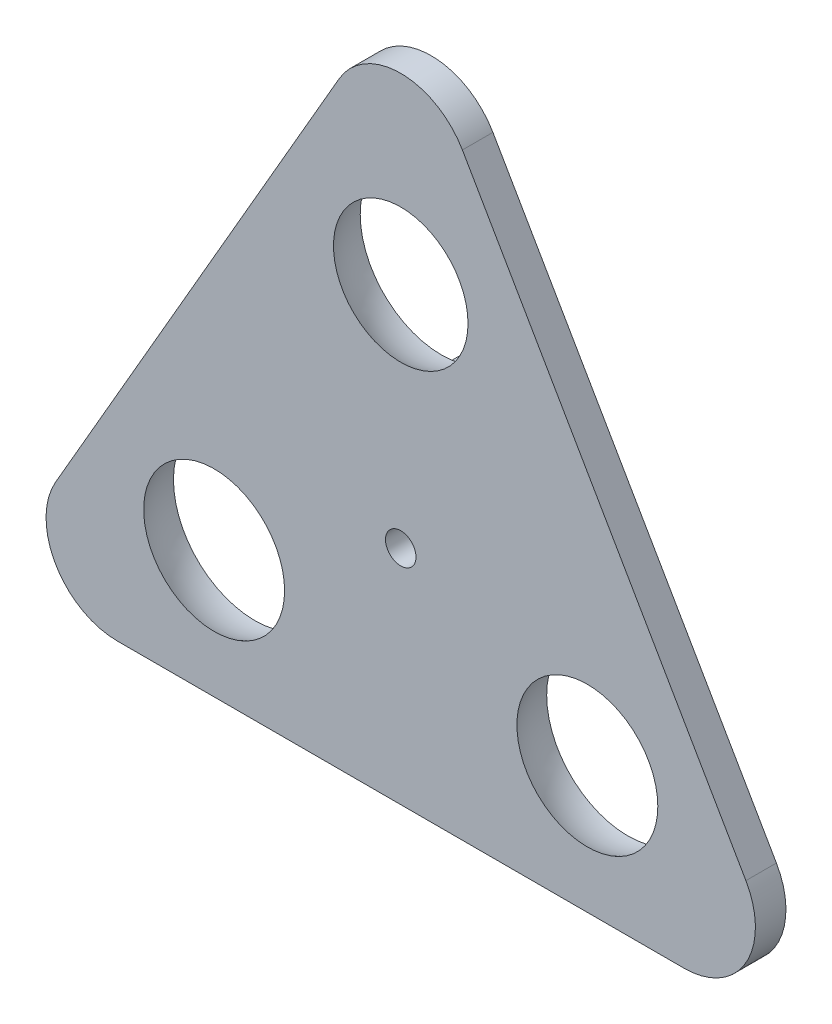
ISO-10303-21;
HEADER;
FILE_DESCRIPTION(('STEP AP214'),'2;1');
FILE_NAME('part.step','',(''),(''),'','','');
FILE_SCHEMA(('AUTOMOTIVE_DESIGN { 1 0 10303 214 1 1 1 1 }'));
ENDSEC;
DATA;
#1=APPLICATION_CONTEXT('core data for automotive mechanical design processes');
#2=APPLICATION_PROTOCOL_DEFINITION('international standard','automotive_design',2000,#1);
#3=PRODUCT_CONTEXT('',#1,'mechanical');
#4=PRODUCT('Part','Part','',(#3));
#5=PRODUCT_RELATED_PRODUCT_CATEGORY('part','',(#4));
#6=PRODUCT_DEFINITION_FORMATION('','',#4);
#7=PRODUCT_DEFINITION_CONTEXT('part definition',#1,'design');
#8=PRODUCT_DEFINITION('design','',#6,#7);
#9=PRODUCT_DEFINITION_SHAPE('','',#8);
#10=(LENGTH_UNIT() NAMED_UNIT(*) SI_UNIT(.MILLI.,.METRE.));
#11=(NAMED_UNIT(*) PLANE_ANGLE_UNIT() SI_UNIT($,.RADIAN.));
#12=(NAMED_UNIT(*) SI_UNIT($,.STERADIAN.) SOLID_ANGLE_UNIT());
#13=UNCERTAINTY_MEASURE_WITH_UNIT(LENGTH_MEASURE(1.E-05),#10,'distance_accuracy_value','');
#14=(GEOMETRIC_REPRESENTATION_CONTEXT(3) GLOBAL_UNCERTAINTY_ASSIGNED_CONTEXT((#13)) GLOBAL_UNIT_ASSIGNED_CONTEXT((#10,
#11,#12)) REPRESENTATION_CONTEXT('',''));
#15=CARTESIAN_POINT('',(0.,0.,0.));
#16=DIRECTION('',(0.,0.,1.));
#17=DIRECTION('',(1.,0.,0.));
#18=AXIS2_PLACEMENT_3D('',#15,#16,#17);
#19=CARTESIAN_POINT('',(0.,0.,0.));
#20=DIRECTION('',(0.,0.,1.));
#21=DIRECTION('',(1.,0.,0.));
#22=AXIS2_PLACEMENT_3D('',#19,#20,#21);
#23=PLANE('',#22);
#24=CARTESIAN_POINT('',(40.,21.8287902820327,0.));
#25=DIRECTION('',(0.,0.,1.));
#26=DIRECTION('',(1.,0.,0.));
#27=AXIS2_PLACEMENT_3D('',#24,#25,#26);
#28=CIRCLE('',#27,1.5);
#29=CARTESIAN_POINT('',(41.5,21.8287902820327,0.));
#30=VERTEX_POINT('',#29);
#31=EDGE_CURVE('E614',#30,#30,#28,.T.);
#32=ORIENTED_EDGE('',*,*,#31,.T.);
#33=EDGE_LOOP('',(#32));
#34=FACE_BOUND('',#33,.T.);
#35=DIRECTION('',(-1.,0.,0.));
#36=VECTOR('',#35,1.);
#37=CARTESIAN_POINT('',(37.,14.3287902820327,0.));
#38=LINE('',#37,#36);
#39=CARTESIAN_POINT('',(37.,14.3287902820327,0.));
#40=VERTEX_POINT('',#39);
#41=CARTESIAN_POINT('',(34.,14.3287902820327,0.));
#42=VERTEX_POINT('',#41);
#43=EDGE_CURVE('E157',#40,#42,#38,.T.);
#44=ORIENTED_EDGE('',*,*,#43,.F.);
#45=DIRECTION('',(0.,-1.,0.));
#46=VECTOR('',#45,1.);
#47=CARTESIAN_POINT('',(37.,29.3287902820327,0.));
#48=LINE('',#47,#46);
#49=CARTESIAN_POINT('',(37.,29.3287902820327,0.));
#50=VERTEX_POINT('',#49);
#51=EDGE_CURVE('E170',#50,#40,#48,.T.);
#52=ORIENTED_EDGE('',*,*,#51,.F.);
#53=DIRECTION('',(1.,0.,0.));
#54=VECTOR('',#53,1.);
#55=CARTESIAN_POINT('',(37.,29.3287902820327,0.));
#56=LINE('',#55,#54);
#57=CARTESIAN_POINT('',(34.,29.3287902820327,0.));
#58=VERTEX_POINT('',#57);
#59=EDGE_CURVE('E179',#58,#50,#56,.T.);
#60=ORIENTED_EDGE('',*,*,#59,.F.);
#61=DIRECTION('',(0.,1.,0.));
#62=VECTOR('',#61,1.);
#63=CARTESIAN_POINT('',(34.,29.3287902820327,0.));
#64=LINE('',#63,#62);
#65=EDGE_CURVE('E160',#42,#58,#64,.T.);
#66=ORIENTED_EDGE('',*,*,#65,.F.);
#67=EDGE_LOOP('',(#44,#52,#60,#66));
#68=FACE_BOUND('',#67,.T.);
#69=CARTESIAN_POINT('',(58.349364905389,12.5,0.));
#70=DIRECTION('',(0.,0.,1.));
#71=DIRECTION('',(1.,0.,0.));
#72=AXIS2_PLACEMENT_3D('',#69,#70,#71);
#73=CIRCLE('',#72,10.);
#74=CARTESIAN_POINT('',(68.349364905389,12.5,0.));
#75=VERTEX_POINT('',#74);
#76=EDGE_CURVE('E42',#75,#75,#73,.F.);
#77=ORIENTED_EDGE('',*,*,#76,.F.);
#78=EDGE_LOOP('',(#77));
#79=FACE_BOUND('',#78,.T.);
#80=DIRECTION('',(-0.5,-0.866025403784439,0.));
#81=VECTOR('',#80,1.);
#82=CARTESIAN_POINT('',(0.,0.,0.));
#83=LINE('',#82,#81);
#84=CARTESIAN_POINT('',(33.9378221735089,58.7820323027551,0.));
#85=VERTEX_POINT('',#84);
#86=CARTESIAN_POINT('',(6.06217782649107,10.5,0.));
#87=VERTEX_POINT('',#86);
#88=EDGE_CURVE('E216',#85,#87,#83,.T.);
#89=ORIENTED_EDGE('',*,*,#88,.F.);
#90=CARTESIAN_POINT('',(40.,55.2820323027551,0.));
#91=DIRECTION('',(0.,0.,1.));
#92=DIRECTION('',(1.,0.,0.));
#93=AXIS2_PLACEMENT_3D('',#90,#91,#92);
#94=CIRCLE('',#93,7.);
#95=CARTESIAN_POINT('',(46.0621778264911,58.7820323027551,0.));
#96=VERTEX_POINT('',#95);
#97=EDGE_CURVE('E255',#85,#96,#94,.F.);
#98=ORIENTED_EDGE('',*,*,#97,.T.);
#99=DIRECTION('',(-0.5,0.866025403784439,0.));
#100=VECTOR('',#99,1.);
#101=CARTESIAN_POINT('',(80.,0.,0.));
#102=LINE('',#101,#100);
#103=CARTESIAN_POINT('',(73.9378221735089,10.5,0.));
#104=VERTEX_POINT('',#103);
#105=EDGE_CURVE('E220',#104,#96,#102,.T.);
#106=ORIENTED_EDGE('',*,*,#105,.F.);
#107=CARTESIAN_POINT('',(67.8756443470179,7.,0.));
#108=DIRECTION('',(0.,0.,1.));
#109=DIRECTION('',(1.,0.,0.));
#110=AXIS2_PLACEMENT_3D('',#107,#108,#109);
#111=CIRCLE('',#110,7.);
#112=CARTESIAN_POINT('',(67.8756443470179,0.,0.));
#113=VERTEX_POINT('',#112);
#114=EDGE_CURVE('E246',#104,#113,#111,.F.);
#115=ORIENTED_EDGE('',*,*,#114,.T.);
#116=DIRECTION('',(1.,0.,0.));
#117=VECTOR('',#116,1.);
#118=CARTESIAN_POINT('',(0.,0.,0.));
#119=LINE('',#118,#117);
#120=CARTESIAN_POINT('',(12.1243556529821,0.,0.));
#121=VERTEX_POINT('',#120);
#122=EDGE_CURVE('E228',#121,#113,#119,.T.);
#123=ORIENTED_EDGE('',*,*,#122,.F.);
#124=CARTESIAN_POINT('',(12.1243556529821,7.,0.));
#125=DIRECTION('',(0.,0.,1.));
#126=DIRECTION('',(1.,0.,0.));
#127=AXIS2_PLACEMENT_3D('',#124,#125,#126);
#128=CIRCLE('',#127,7.);
#129=EDGE_CURVE('E235',#121,#87,#128,.F.);
#130=ORIENTED_EDGE('',*,*,#129,.T.);
#131=EDGE_LOOP('',(#89,#98,#106,#115,#123,#130));
#132=FACE_BOUND('',#131,.T.);
#133=CARTESIAN_POINT('',(40.,44.2820323027551,0.));
#134=DIRECTION('',(0.,0.,1.));
#135=DIRECTION('',(1.,0.,0.));
#136=AXIS2_PLACEMENT_3D('',#133,#134,#135);
#137=CIRCLE('',#136,10.);
#138=CARTESIAN_POINT('',(50.,44.2820323027551,0.));
#139=VERTEX_POINT('',#138);
#140=EDGE_CURVE('E261',#139,#139,#137,.F.);
#141=ORIENTED_EDGE('',*,*,#140,.F.);
#142=EDGE_LOOP('',(#141));
#143=FACE_BOUND('',#142,.T.);
#144=CARTESIAN_POINT('',(21.6506350946109,12.5000000000001,0.));
#145=DIRECTION('',(0.,0.,1.));
#146=DIRECTION('',(1.,0.,0.));
#147=AXIS2_PLACEMENT_3D('',#144,#145,#146);
#148=CIRCLE('',#147,10.);
#149=CARTESIAN_POINT('',(31.6506350946109,12.5000000000001,0.));
#150=VERTEX_POINT('',#149);
#151=EDGE_CURVE('E11',#150,#150,#148,.F.);
#152=ORIENTED_EDGE('',*,*,#151,.F.);
#153=EDGE_LOOP('',(#152));
#154=FACE_BOUND('',#153,.T.);
#155=DIRECTION('',(0.,1.,0.));
#156=VECTOR('',#155,1.);
#157=CARTESIAN_POINT('',(43.,29.3287902820327,0.));
#158=LINE('',#157,#156);
#159=CARTESIAN_POINT('',(43.,14.3287902820327,0.));
#160=VERTEX_POINT('',#159);
#161=CARTESIAN_POINT('',(43.,29.3287902820327,0.));
#162=VERTEX_POINT('',#161);
#163=EDGE_CURVE('E156',#160,#162,#158,.T.);
#164=ORIENTED_EDGE('',*,*,#163,.F.);
#165=DIRECTION('',(-1.,0.,0.));
#166=VECTOR('',#165,1.);
#167=CARTESIAN_POINT('',(43.,14.3287902820327,0.));
#168=LINE('',#167,#166);
#169=CARTESIAN_POINT('',(46.,14.3287902820327,0.));
#170=VERTEX_POINT('',#169);
#171=EDGE_CURVE('E153',#170,#160,#168,.T.);
#172=ORIENTED_EDGE('',*,*,#171,.F.);
#173=DIRECTION('',(0.,-1.,0.));
#174=VECTOR('',#173,1.);
#175=CARTESIAN_POINT('',(46.,29.3287902820327,0.));
#176=LINE('',#175,#174);
#177=CARTESIAN_POINT('',(46.,29.3287902820327,0.));
#178=VERTEX_POINT('',#177);
#179=EDGE_CURVE('E55',#178,#170,#176,.T.);
#180=ORIENTED_EDGE('',*,*,#179,.F.);
#181=DIRECTION('',(1.,0.,0.));
#182=VECTOR('',#181,1.);
#183=CARTESIAN_POINT('',(43.,29.3287902820327,0.));
#184=LINE('',#183,#182);
#185=EDGE_CURVE('E50',#162,#178,#184,.T.);
#186=ORIENTED_EDGE('',*,*,#185,.F.);
#187=EDGE_LOOP('',(#164,#172,#180,#186));
#188=FACE_BOUND('',#187,.T.);
#189=ADVANCED_FACE('F33',(#34,#68,#79,#132,#143,#154,#188),#23,.F.);
#190=CARTESIAN_POINT('',(0.,0.,3.));
#191=DIRECTION('',(0.,0.,1.));
#192=DIRECTION('',(1.,0.,0.));
#193=AXIS2_PLACEMENT_3D('',#190,#191,#192);
#194=PLANE('',#193);
#195=CARTESIAN_POINT('',(40.,21.8287902820327,3.));
#196=DIRECTION('',(0.,0.,1.));
#197=DIRECTION('',(1.,0.,0.));
#198=AXIS2_PLACEMENT_3D('',#195,#196,#197);
#199=CIRCLE('',#198,1.5);
#200=CARTESIAN_POINT('',(41.5,21.8287902820327,3.));
#201=VERTEX_POINT('',#200);
#202=EDGE_CURVE('E612',#201,#201,#199,.T.);
#203=ORIENTED_EDGE('',*,*,#202,.F.);
#204=EDGE_LOOP('',(#203));
#205=FACE_BOUND('',#204,.T.);
#206=CARTESIAN_POINT('',(58.349364905389,12.5,3.));
#207=DIRECTION('',(0.,0.,1.));
#208=DIRECTION('',(1.,0.,0.));
#209=AXIS2_PLACEMENT_3D('',#206,#207,#208);
#210=CIRCLE('',#209,6.92820323027551);
#211=CARTESIAN_POINT('',(65.2775681356645,12.5,3.));
#212=VERTEX_POINT('',#211);
#213=EDGE_CURVE('E200',#212,#212,#210,.F.);
#214=ORIENTED_EDGE('',*,*,#213,.T.);
#215=EDGE_LOOP('',(#214));
#216=FACE_BOUND('',#215,.T.);
#217=DIRECTION('',(-0.5,0.866025403784439,0.));
#218=VECTOR('',#217,1.);
#219=CARTESIAN_POINT('',(80.,0.,3.));
#220=LINE('',#219,#218);
#221=CARTESIAN_POINT('',(73.9378221735089,10.5,3.));
#222=VERTEX_POINT('',#221);
#223=CARTESIAN_POINT('',(46.0621778264911,58.7820323027551,3.));
#224=VERTEX_POINT('',#223);
#225=EDGE_CURVE('E223',#222,#224,#220,.T.);
#226=ORIENTED_EDGE('',*,*,#225,.T.);
#227=CARTESIAN_POINT('',(40.,55.2820323027551,3.));
#228=DIRECTION('',(0.,0.,1.));
#229=DIRECTION('',(1.,0.,0.));
#230=AXIS2_PLACEMENT_3D('',#227,#228,#229);
#231=CIRCLE('',#230,7.);
#232=CARTESIAN_POINT('',(33.9378221735089,58.7820323027551,3.));
#233=VERTEX_POINT('',#232);
#234=EDGE_CURVE('E259',#224,#233,#231,.T.);
#235=ORIENTED_EDGE('',*,*,#234,.T.);
#236=DIRECTION('',(-0.5,-0.866025403784439,0.));
#237=VECTOR('',#236,1.);
#238=CARTESIAN_POINT('',(0.,0.,3.));
#239=LINE('',#238,#237);
#240=CARTESIAN_POINT('',(6.06217782649107,10.5,3.));
#241=VERTEX_POINT('',#240);
#242=EDGE_CURVE('E217',#233,#241,#239,.T.);
#243=ORIENTED_EDGE('',*,*,#242,.T.);
#244=CARTESIAN_POINT('',(12.1243556529821,7.,3.));
#245=DIRECTION('',(0.,0.,1.));
#246=DIRECTION('',(1.,0.,0.));
#247=AXIS2_PLACEMENT_3D('',#244,#245,#246);
#248=CIRCLE('',#247,7.);
#249=CARTESIAN_POINT('',(12.1243556529821,0.,3.));
#250=VERTEX_POINT('',#249);
#251=EDGE_CURVE('E241',#241,#250,#248,.T.);
#252=ORIENTED_EDGE('',*,*,#251,.T.);
#253=DIRECTION('',(1.,0.,0.));
#254=VECTOR('',#253,1.);
#255=CARTESIAN_POINT('',(0.,0.,3.));
#256=LINE('',#255,#254);
#257=CARTESIAN_POINT('',(67.8756443470179,0.,3.));
#258=VERTEX_POINT('',#257);
#259=EDGE_CURVE('E219',#250,#258,#256,.T.);
#260=ORIENTED_EDGE('',*,*,#259,.T.);
#261=CARTESIAN_POINT('',(67.8756443470179,7.,3.));
#262=DIRECTION('',(0.,0.,1.));
#263=DIRECTION('',(1.,0.,0.));
#264=AXIS2_PLACEMENT_3D('',#261,#262,#263);
#265=CIRCLE('',#264,7.);
#266=EDGE_CURVE('E250',#258,#222,#265,.T.);
#267=ORIENTED_EDGE('',*,*,#266,.T.);
#268=EDGE_LOOP('',(#226,#235,#243,#252,#260,#267));
#269=FACE_BOUND('',#268,.T.);
#270=CARTESIAN_POINT('',(40.,44.2820323027551,3.));
#271=DIRECTION('',(0.,0.,1.));
#272=DIRECTION('',(1.,0.,0.));
#273=AXIS2_PLACEMENT_3D('',#270,#271,#272);
#274=CIRCLE('',#273,6.61437827766148);
#275=CARTESIAN_POINT('',(46.6143782776615,44.2820323027551,3.));
#276=VERTEX_POINT('',#275);
#277=EDGE_CURVE('E204',#276,#276,#274,.F.);
#278=ORIENTED_EDGE('',*,*,#277,.T.);
#279=EDGE_LOOP('',(#278));
#280=FACE_BOUND('',#279,.T.);
#281=CARTESIAN_POINT('',(21.6506350946109,12.5000000000001,3.));
#282=DIRECTION('',(0.,0.,1.));
#283=DIRECTION('',(1.,0.,0.));
#284=AXIS2_PLACEMENT_3D('',#281,#282,#283);
#285=CIRCLE('',#284,6.92820323027551);
#286=CARTESIAN_POINT('',(28.5788383248864,12.5000000000001,3.));
#287=VERTEX_POINT('',#286);
#288=EDGE_CURVE('E196',#287,#287,#285,.F.);
#289=ORIENTED_EDGE('',*,*,#288,.T.);
#290=EDGE_LOOP('',(#289));
#291=FACE_BOUND('',#290,.T.);
#292=ADVANCED_FACE('F317',(#205,#216,#269,#280,#291),#194,.T.);
#293=CARTESIAN_POINT('',(21.6506350946109,12.5000000000001,-1.));
#294=DIRECTION('',(0.,0.,-1.));
#295=DIRECTION('',(-1.,0.,0.));
#296=AXIS2_PLACEMENT_3D('',#293,#294,#295);
#297=PLANE('',#296);
#298=CARTESIAN_POINT('',(21.6506350946109,12.5000000000001,-1.));
#299=DIRECTION('',(0.,0.,-1.));
#300=DIRECTION('',(-1.,0.,0.));
#301=AXIS2_PLACEMENT_3D('',#298,#299,#300);
#302=CIRCLE('',#301,10.);
#303=CARTESIAN_POINT('',(11.6506350946109,12.5000000000001,-1.));
#304=VERTEX_POINT('',#303);
#305=EDGE_CURVE('E207',#304,#304,#302,.T.);
#306=ORIENTED_EDGE('',*,*,#305,.T.);
#307=EDGE_LOOP('',(#306));
#308=FACE_BOUND('',#307,.T.);
#309=CARTESIAN_POINT('',(21.6506350946109,12.5000000000001,-1.));
#310=DIRECTION('',(0.,0.,-1.));
#311=DIRECTION('',(-1.,0.,0.));
#312=AXIS2_PLACEMENT_3D('',#309,#310,#311);
#313=CIRCLE('',#312,8.);
#314=CARTESIAN_POINT('',(13.6506350946109,12.5000000000001,-1.));
#315=VERTEX_POINT('',#314);
#316=EDGE_CURVE('E195',#315,#315,#313,.F.);
#317=ORIENTED_EDGE('',*,*,#316,.T.);
#318=EDGE_LOOP('',(#317));
#319=FACE_BOUND('',#318,.T.);
#320=ADVANCED_FACE('F323',(#308,#319),#297,.T.);
#321=CARTESIAN_POINT('',(58.349364905389,12.5,-1.));
#322=DIRECTION('',(0.,0.,-1.));
#323=DIRECTION('',(-1.,0.,0.));
#324=AXIS2_PLACEMENT_3D('',#321,#322,#323);
#325=PLANE('',#324);
#326=CARTESIAN_POINT('',(58.349364905389,12.5,-1.));
#327=DIRECTION('',(0.,0.,-1.));
#328=DIRECTION('',(-1.,0.,0.));
#329=AXIS2_PLACEMENT_3D('',#326,#327,#328);
#330=CIRCLE('',#329,10.);
#331=CARTESIAN_POINT('',(48.349364905389,12.5,-1.));
#332=VERTEX_POINT('',#331);
#333=EDGE_CURVE('E210',#332,#332,#330,.T.);
#334=ORIENTED_EDGE('',*,*,#333,.T.);
#335=EDGE_LOOP('',(#334));
#336=FACE_BOUND('',#335,.T.);
#337=CARTESIAN_POINT('',(58.349364905389,12.5,-1.));
#338=DIRECTION('',(0.,0.,-1.));
#339=DIRECTION('',(-1.,0.,0.));
#340=AXIS2_PLACEMENT_3D('',#337,#338,#339);
#341=CIRCLE('',#340,8.);
#342=CARTESIAN_POINT('',(50.349364905389,12.5,-1.));
#343=VERTEX_POINT('',#342);
#344=EDGE_CURVE('E199',#343,#343,#341,.F.);
#345=ORIENTED_EDGE('',*,*,#344,.T.);
#346=EDGE_LOOP('',(#345));
#347=FACE_BOUND('',#346,.T.);
#348=ADVANCED_FACE('F395',(#336,#347),#325,.T.);
#349=CARTESIAN_POINT('',(40.,44.2820323027551,-1.));
#350=DIRECTION('',(0.,0.,-1.));
#351=DIRECTION('',(-1.,0.,0.));
#352=AXIS2_PLACEMENT_3D('',#349,#350,#351);
#353=PLANE('',#352);
#354=CARTESIAN_POINT('',(40.,44.2820323027551,-1.));
#355=DIRECTION('',(0.,0.,-1.));
#356=DIRECTION('',(-1.,0.,0.));
#357=AXIS2_PLACEMENT_3D('',#354,#355,#356);
#358=CIRCLE('',#357,10.);
#359=CARTESIAN_POINT('',(30.,44.2820323027551,-1.));
#360=VERTEX_POINT('',#359);
#361=EDGE_CURVE('E213',#360,#360,#358,.T.);
#362=ORIENTED_EDGE('',*,*,#361,.T.);
#363=EDGE_LOOP('',(#362));
#364=FACE_BOUND('',#363,.T.);
#365=CARTESIAN_POINT('',(40.,44.2820323027551,-1.));
#366=DIRECTION('',(0.,0.,-1.));
#367=DIRECTION('',(-1.,0.,0.));
#368=AXIS2_PLACEMENT_3D('',#365,#366,#367);
#369=CIRCLE('',#368,7.98435971133565);
#370=CARTESIAN_POINT('',(32.0156402886643,44.2820323027551,-1.));
#371=VERTEX_POINT('',#370);
#372=EDGE_CURVE('E203',#371,#371,#369,.F.);
#373=ORIENTED_EDGE('',*,*,#372,.T.);
#374=EDGE_LOOP('',(#373));
#375=FACE_BOUND('',#374,.T.);
#376=ADVANCED_FACE('F342',(#364,#375),#353,.T.);
#377=CARTESIAN_POINT('',(0.,0.,3.));
#378=DIRECTION('',(0.866025403784439,-0.5,0.));
#379=DIRECTION('',(0.5,0.866025403784439,0.));
#380=AXIS2_PLACEMENT_3D('',#377,#378,#379);
#381=PLANE('',#380);
#382=ORIENTED_EDGE('',*,*,#242,.F.);
#383=DIRECTION('',(0.,0.,-1.));
#384=VECTOR('',#383,1.);
#385=CARTESIAN_POINT('',(33.9378221735089,58.7820323027551,3.));
#386=LINE('',#385,#384);
#387=EDGE_CURVE('E252',#233,#85,#386,.T.);
#388=ORIENTED_EDGE('',*,*,#387,.T.);
#389=ORIENTED_EDGE('',*,*,#88,.T.);
#390=DIRECTION('',(0.,0.,-1.));
#391=VECTOR('',#390,1.);
#392=CARTESIAN_POINT('',(6.06217782649107,10.5,3.));
#393=LINE('',#392,#391);
#394=EDGE_CURVE('E238',#87,#241,#393,.F.);
#395=ORIENTED_EDGE('',*,*,#394,.T.);
#396=EDGE_LOOP('',(#382,#388,#389,#395));
#397=FACE_BOUND('',#396,.T.);
#398=ADVANCED_FACE('F338',(#397),#381,.F.);
#399=CARTESIAN_POINT('',(0.,0.,3.));
#400=DIRECTION('',(0.,1.,0.));
#401=DIRECTION('',(0.,0.,1.));
#402=AXIS2_PLACEMENT_3D('',#399,#400,#401);
#403=PLANE('',#402);
#404=ORIENTED_EDGE('',*,*,#122,.T.);
#405=DIRECTION('',(0.,0.,-1.));
#406=VECTOR('',#405,1.);
#407=CARTESIAN_POINT('',(67.8756443470179,0.,3.));
#408=LINE('',#407,#406);
#409=EDGE_CURVE('E248',#113,#258,#408,.F.);
#410=ORIENTED_EDGE('',*,*,#409,.T.);
#411=ORIENTED_EDGE('',*,*,#259,.F.);
#412=DIRECTION('',(0.,0.,-1.));
#413=VECTOR('',#412,1.);
#414=CARTESIAN_POINT('',(12.1243556529821,0.,3.));
#415=LINE('',#414,#413);
#416=EDGE_CURVE('E226',#250,#121,#415,.T.);
#417=ORIENTED_EDGE('',*,*,#416,.T.);
#418=EDGE_LOOP('',(#404,#410,#411,#417));
#419=FACE_BOUND('',#418,.T.);
#420=ADVANCED_FACE('F334',(#419),#403,.F.);
#421=CARTESIAN_POINT('',(80.,0.,3.));
#422=DIRECTION('',(-0.866025403784439,-0.5,0.));
#423=DIRECTION('',(0.5,-0.866025403784439,0.));
#424=AXIS2_PLACEMENT_3D('',#421,#422,#423);
#425=PLANE('',#424);
#426=ORIENTED_EDGE('',*,*,#105,.T.);
#427=DIRECTION('',(0.,0.,-1.));
#428=VECTOR('',#427,1.);
#429=CARTESIAN_POINT('',(46.0621778264911,58.7820323027551,3.));
#430=LINE('',#429,#428);
#431=EDGE_CURVE('E257',#96,#224,#430,.F.);
#432=ORIENTED_EDGE('',*,*,#431,.T.);
#433=ORIENTED_EDGE('',*,*,#225,.F.);
#434=DIRECTION('',(0.,0.,-1.));
#435=VECTOR('',#434,1.);
#436=CARTESIAN_POINT('',(73.9378221735089,10.5,3.));
#437=LINE('',#436,#435);
#438=EDGE_CURVE('E243',#222,#104,#437,.T.);
#439=ORIENTED_EDGE('',*,*,#438,.T.);
#440=EDGE_LOOP('',(#426,#432,#433,#439));
#441=FACE_BOUND('',#440,.T.);
#442=ADVANCED_FACE('F330',(#441),#425,.F.);
#443=CARTESIAN_POINT('',(12.1243556529821,7.,3.));
#444=DIRECTION('',(0.,0.,-1.));
#445=DIRECTION('',(-1.,0.,0.));
#446=AXIS2_PLACEMENT_3D('',#443,#444,#445);
#447=CYLINDRICAL_SURFACE('',#446,7.);
#448=ORIENTED_EDGE('',*,*,#251,.F.);
#449=ORIENTED_EDGE('',*,*,#394,.F.);
#450=ORIENTED_EDGE('',*,*,#129,.F.);
#451=ORIENTED_EDGE('',*,*,#416,.F.);
#452=EDGE_LOOP('',(#448,#449,#450,#451));
#453=FACE_BOUND('',#452,.T.);
#454=ADVANCED_FACE('F333',(#453),#447,.T.);
#455=CARTESIAN_POINT('',(67.8756443470179,7.,3.));
#456=DIRECTION('',(0.,0.,-1.));
#457=DIRECTION('',(-1.,0.,0.));
#458=AXIS2_PLACEMENT_3D('',#455,#456,#457);
#459=CYLINDRICAL_SURFACE('',#458,7.);
#460=ORIENTED_EDGE('',*,*,#266,.F.);
#461=ORIENTED_EDGE('',*,*,#409,.F.);
#462=ORIENTED_EDGE('',*,*,#114,.F.);
#463=ORIENTED_EDGE('',*,*,#438,.F.);
#464=EDGE_LOOP('',(#460,#461,#462,#463));
#465=FACE_BOUND('',#464,.T.);
#466=ADVANCED_FACE('F345',(#465),#459,.T.);
#467=CARTESIAN_POINT('',(40.,55.2820323027551,3.));
#468=DIRECTION('',(0.,0.,-1.));
#469=DIRECTION('',(-1.,0.,0.));
#470=AXIS2_PLACEMENT_3D('',#467,#468,#469);
#471=CYLINDRICAL_SURFACE('',#470,7.);
#472=ORIENTED_EDGE('',*,*,#234,.F.);
#473=ORIENTED_EDGE('',*,*,#431,.F.);
#474=ORIENTED_EDGE('',*,*,#97,.F.);
#475=ORIENTED_EDGE('',*,*,#387,.F.);
#476=EDGE_LOOP('',(#472,#473,#474,#475));
#477=FACE_BOUND('',#476,.T.);
#478=ADVANCED_FACE('F35',(#477),#471,.T.);
#479=CARTESIAN_POINT('',(40.,44.2820323027551,-1.));
#480=DIRECTION('',(0.,0.,1.));
#481=DIRECTION('',(1.,0.,0.));
#482=AXIS2_PLACEMENT_3D('',#479,#480,#481);
#483=CYLINDRICAL_SURFACE('',#482,10.);
#484=ORIENTED_EDGE('',*,*,#361,.F.);
#485=EDGE_LOOP('',(#484));
#486=FACE_BOUND('',#485,.T.);
#487=ORIENTED_EDGE('',*,*,#140,.T.);
#488=EDGE_LOOP('',(#487));
#489=FACE_BOUND('',#488,.T.);
#490=ADVANCED_FACE('F352',(#486,#489),#483,.T.);
#491=CARTESIAN_POINT('',(58.349364905389,12.5,-1.));
#492=DIRECTION('',(0.,0.,1.));
#493=DIRECTION('',(1.,0.,0.));
#494=AXIS2_PLACEMENT_3D('',#491,#492,#493);
#495=CYLINDRICAL_SURFACE('',#494,10.);
#496=ORIENTED_EDGE('',*,*,#333,.F.);
#497=EDGE_LOOP('',(#496));
#498=FACE_BOUND('',#497,.T.);
#499=ORIENTED_EDGE('',*,*,#76,.T.);
#500=EDGE_LOOP('',(#499));
#501=FACE_BOUND('',#500,.T.);
#502=ADVANCED_FACE('F380',(#498,#501),#495,.T.);
#503=CARTESIAN_POINT('',(21.6506350946109,12.5000000000001,-1.));
#504=DIRECTION('',(0.,0.,1.));
#505=DIRECTION('',(1.,0.,0.));
#506=AXIS2_PLACEMENT_3D('',#503,#504,#505);
#507=CYLINDRICAL_SURFACE('',#506,10.);
#508=ORIENTED_EDGE('',*,*,#305,.F.);
#509=EDGE_LOOP('',(#508));
#510=FACE_BOUND('',#509,.T.);
#511=ORIENTED_EDGE('',*,*,#151,.T.);
#512=EDGE_LOOP('',(#511));
#513=FACE_BOUND('',#512,.T.);
#514=ADVANCED_FACE('F377',(#510,#513),#507,.T.);
#515=CARTESIAN_POINT('',(40.,44.2820323027551,-1.5));
#516=DIRECTION('',(0.,1.,0.));
#517=DIRECTION('',(-1.,0.,0.));
#518=AXIS2_PLACEMENT_3D('',#515,#516,#517);
#519=SPHERICAL_SURFACE('',#518,8.);
#520=CARTESIAN_POINT('',(40.,44.2820323027551,-1.5));
#521=DIRECTION('',(0.,0.,1.));
#522=DIRECTION('',(1.,0.,0.));
#523=AXIS2_PLACEMENT_3D('',#520,#521,#522);
#524=SPHERICAL_SURFACE('',#523,8.);
#525=ORIENTED_EDGE('',*,*,#277,.F.);
#526=EDGE_LOOP('',(#525));
#527=FACE_BOUND('',#526,.T.);
#528=ORIENTED_EDGE('',*,*,#372,.F.);
#529=EDGE_LOOP('',(#528));
#530=FACE_BOUND('',#529,.T.);
#531=ADVANCED_FACE('F379',(#527,#530),#524,.F.);
#532=CARTESIAN_POINT('',(58.349364905389,12.5,-1.));
#533=DIRECTION('',(0.,1.,0.));
#534=DIRECTION('',(-1.,0.,0.));
#535=AXIS2_PLACEMENT_3D('',#532,#533,#534);
#536=SPHERICAL_SURFACE('',#535,8.);
#537=CARTESIAN_POINT('',(58.349364905389,12.5,-1.));
#538=DIRECTION('',(0.,0.,1.));
#539=DIRECTION('',(1.,0.,0.));
#540=AXIS2_PLACEMENT_3D('',#537,#538,#539);
#541=SPHERICAL_SURFACE('',#540,8.);
#542=ORIENTED_EDGE('',*,*,#213,.F.);
#543=EDGE_LOOP('',(#542));
#544=FACE_BOUND('',#543,.T.);
#545=ORIENTED_EDGE('',*,*,#344,.F.);
#546=EDGE_LOOP('',(#545));
#547=FACE_BOUND('',#546,.T.);
#548=ADVANCED_FACE('F387',(#544,#547),#541,.F.);
#549=CARTESIAN_POINT('',(21.6506350946109,12.5000000000001,-1.));
#550=DIRECTION('',(0.,1.,0.));
#551=DIRECTION('',(-1.,0.,0.));
#552=AXIS2_PLACEMENT_3D('',#549,#550,#551);
#553=SPHERICAL_SURFACE('',#552,8.);
#554=CARTESIAN_POINT('',(21.6506350946109,12.5000000000001,-1.));
#555=DIRECTION('',(0.,0.,1.));
#556=DIRECTION('',(1.,0.,0.));
#557=AXIS2_PLACEMENT_3D('',#554,#555,#556);
#558=SPHERICAL_SURFACE('',#557,8.);
#559=ORIENTED_EDGE('',*,*,#288,.F.);
#560=EDGE_LOOP('',(#559));
#561=FACE_BOUND('',#560,.T.);
#562=ORIENTED_EDGE('',*,*,#316,.F.);
#563=EDGE_LOOP('',(#562));
#564=FACE_BOUND('',#563,.T.);
#565=ADVANCED_FACE('F448',(#561,#564),#558,.F.);
#566=CARTESIAN_POINT('',(37.,14.3287902820327,-9.));
#567=DIRECTION('',(0.,1.,0.));
#568=DIRECTION('',(0.,0.,1.));
#569=AXIS2_PLACEMENT_3D('',#566,#567,#568);
#570=PLANE('',#569);
#571=ORIENTED_EDGE('',*,*,#43,.T.);
#572=DIRECTION('',(0.,0.,1.));
#573=VECTOR('',#572,1.);
#574=CARTESIAN_POINT('',(34.,14.3287902820327,-9.));
#575=LINE('',#574,#573);
#576=CARTESIAN_POINT('',(34.,14.3287902820327,-9.));
#577=VERTEX_POINT('',#576);
#578=EDGE_CURVE('E192',#577,#42,#575,.T.);
#579=ORIENTED_EDGE('',*,*,#578,.F.);
#580=DIRECTION('',(-1.,0.,0.));
#581=VECTOR('',#580,1.);
#582=CARTESIAN_POINT('',(37.,14.3287902820327,-9.));
#583=LINE('',#582,#581);
#584=CARTESIAN_POINT('',(37.,14.3287902820327,-9.));
#585=VERTEX_POINT('',#584);
#586=EDGE_CURVE('E166',#585,#577,#583,.T.);
#587=ORIENTED_EDGE('',*,*,#586,.F.);
#588=DIRECTION('',(0.,0.,1.));
#589=VECTOR('',#588,1.);
#590=CARTESIAN_POINT('',(37.,14.3287902820327,-9.));
#591=LINE('',#590,#589);
#592=EDGE_CURVE('E175',#585,#40,#591,.T.);
#593=ORIENTED_EDGE('',*,*,#592,.T.);
#594=EDGE_LOOP('',(#571,#579,#587,#593));
#595=FACE_BOUND('',#594,.T.);
#596=ADVANCED_FACE('F466',(#595),#570,.F.);
#597=CARTESIAN_POINT('',(34.,29.3287902820327,-9.));
#598=DIRECTION('',(1.,0.,0.));
#599=DIRECTION('',(0.,1.,0.));
#600=AXIS2_PLACEMENT_3D('',#597,#598,#599);
#601=PLANE('',#600);
#602=CARTESIAN_POINT('',(34.,18.8287902820327,-4.5));
#603=DIRECTION('',(-1.,0.,0.));
#604=DIRECTION('',(0.,-1.,0.));
#605=AXIS2_PLACEMENT_3D('',#602,#603,#604);
#606=CIRCLE('',#605,1.5);
#607=CARTESIAN_POINT('',(34.,17.3287902820327,-4.5));
#608=VERTEX_POINT('',#607);
#609=EDGE_CURVE('E615',#608,#608,#606,.T.);
#610=ORIENTED_EDGE('',*,*,#609,.F.);
#611=EDGE_LOOP('',(#610));
#612=FACE_BOUND('',#611,.T.);
#613=CARTESIAN_POINT('',(34.,24.8287902820327,-4.5));
#614=DIRECTION('',(-1.,0.,0.));
#615=DIRECTION('',(0.,-1.,0.));
#616=AXIS2_PLACEMENT_3D('',#613,#614,#615);
#617=CIRCLE('',#616,1.5);
#618=CARTESIAN_POINT('',(34.,23.3287902820327,-4.5));
#619=VERTEX_POINT('',#618);
#620=EDGE_CURVE('E274',#619,#619,#617,.T.);
#621=ORIENTED_EDGE('',*,*,#620,.F.);
#622=EDGE_LOOP('',(#621));
#623=FACE_BOUND('',#622,.T.);
#624=ORIENTED_EDGE('',*,*,#65,.T.);
#625=DIRECTION('',(0.,0.,1.));
#626=VECTOR('',#625,1.);
#627=CARTESIAN_POINT('',(34.,29.3287902820327,-9.));
#628=LINE('',#627,#626);
#629=CARTESIAN_POINT('',(34.,29.3287902820327,-9.));
#630=VERTEX_POINT('',#629);
#631=EDGE_CURVE('E189',#630,#58,#628,.T.);
#632=ORIENTED_EDGE('',*,*,#631,.F.);
#633=DIRECTION('',(0.,1.,0.));
#634=VECTOR('',#633,1.);
#635=CARTESIAN_POINT('',(34.,29.3287902820327,-9.));
#636=LINE('',#635,#634);
#637=EDGE_CURVE('E169',#577,#630,#636,.T.);
#638=ORIENTED_EDGE('',*,*,#637,.F.);
#639=ORIENTED_EDGE('',*,*,#578,.T.);
#640=EDGE_LOOP('',(#624,#632,#638,#639));
#641=FACE_BOUND('',#640,.T.);
#642=ADVANCED_FACE('F477',(#612,#623,#641),#601,.F.);
#643=CARTESIAN_POINT('',(37.,29.3287902820327,-9.));
#644=DIRECTION('',(0.,-1.,0.));
#645=DIRECTION('',(0.,0.,-1.));
#646=AXIS2_PLACEMENT_3D('',#643,#644,#645);
#647=PLANE('',#646);
#648=ORIENTED_EDGE('',*,*,#59,.T.);
#649=DIRECTION('',(0.,0.,1.));
#650=VECTOR('',#649,1.);
#651=CARTESIAN_POINT('',(37.,29.3287902820327,-9.));
#652=LINE('',#651,#650);
#653=CARTESIAN_POINT('',(37.,29.3287902820327,-9.));
#654=VERTEX_POINT('',#653);
#655=EDGE_CURVE('E186',#654,#50,#652,.T.);
#656=ORIENTED_EDGE('',*,*,#655,.F.);
#657=DIRECTION('',(1.,0.,0.));
#658=VECTOR('',#657,1.);
#659=CARTESIAN_POINT('',(37.,29.3287902820327,-9.));
#660=LINE('',#659,#658);
#661=EDGE_CURVE('E172',#630,#654,#660,.T.);
#662=ORIENTED_EDGE('',*,*,#661,.F.);
#663=ORIENTED_EDGE('',*,*,#631,.T.);
#664=EDGE_LOOP('',(#648,#656,#662,#663));
#665=FACE_BOUND('',#664,.T.);
#666=ADVANCED_FACE('F485',(#665),#647,.F.);
#667=CARTESIAN_POINT('',(37.,29.3287902820327,-9.));
#668=DIRECTION('',(-1.,0.,0.));
#669=DIRECTION('',(0.,0.,1.));
#670=AXIS2_PLACEMENT_3D('',#667,#668,#669);
#671=PLANE('',#670);
#672=CARTESIAN_POINT('',(37.,18.8287902820327,-4.5));
#673=DIRECTION('',(-1.,0.,0.));
#674=DIRECTION('',(0.,0.,1.));
#675=AXIS2_PLACEMENT_3D('',#672,#673,#674);
#676=CIRCLE('',#675,1.5);
#677=CARTESIAN_POINT('',(37.,18.8287902820327,-3.));
#678=VERTEX_POINT('',#677);
#679=EDGE_CURVE('E281',#678,#678,#676,.T.);
#680=ORIENTED_EDGE('',*,*,#679,.T.);
#681=EDGE_LOOP('',(#680));
#682=FACE_BOUND('',#681,.T.);
#683=CARTESIAN_POINT('',(37.,24.8287902820327,-4.5));
#684=DIRECTION('',(-1.,0.,0.));
#685=DIRECTION('',(0.,0.,1.));
#686=AXIS2_PLACEMENT_3D('',#683,#684,#685);
#687=CIRCLE('',#686,1.5);
#688=CARTESIAN_POINT('',(37.,24.8287902820327,-3.));
#689=VERTEX_POINT('',#688);
#690=EDGE_CURVE('E278',#689,#689,#687,.T.);
#691=ORIENTED_EDGE('',*,*,#690,.T.);
#692=EDGE_LOOP('',(#691));
#693=FACE_BOUND('',#692,.T.);
#694=ORIENTED_EDGE('',*,*,#51,.T.);
#695=ORIENTED_EDGE('',*,*,#592,.F.);
#696=DIRECTION('',(0.,-1.,0.));
#697=VECTOR('',#696,1.);
#698=CARTESIAN_POINT('',(37.,29.3287902820327,-9.));
#699=LINE('',#698,#697);
#700=EDGE_CURVE('E174',#654,#585,#699,.T.);
#701=ORIENTED_EDGE('',*,*,#700,.F.);
#702=ORIENTED_EDGE('',*,*,#655,.T.);
#703=EDGE_LOOP('',(#694,#695,#701,#702));
#704=FACE_BOUND('',#703,.T.);
#705=ADVANCED_FACE('F490',(#682,#693,#704),#671,.F.);
#706=CARTESIAN_POINT('',(0.,0.,-9.));
#707=DIRECTION('',(0.,0.,1.));
#708=DIRECTION('',(1.,0.,0.));
#709=AXIS2_PLACEMENT_3D('',#706,#707,#708);
#710=PLANE('',#709);
#711=ORIENTED_EDGE('',*,*,#586,.T.);
#712=ORIENTED_EDGE('',*,*,#637,.T.);
#713=ORIENTED_EDGE('',*,*,#661,.T.);
#714=ORIENTED_EDGE('',*,*,#700,.T.);
#715=EDGE_LOOP('',(#711,#712,#713,#714));
#716=FACE_BOUND('',#715,.T.);
#717=ADVANCED_FACE('F498',(#716),#710,.F.);
#718=CARTESIAN_POINT('',(43.,29.3287902820327,-9.));
#719=DIRECTION('',(1.,0.,0.));
#720=DIRECTION('',(0.,0.,-1.));
#721=AXIS2_PLACEMENT_3D('',#718,#719,#720);
#722=PLANE('',#721);
#723=CARTESIAN_POINT('',(43.,18.8287902820327,-4.5));
#724=DIRECTION('',(1.,0.,0.));
#725=DIRECTION('',(0.,0.,-1.));
#726=AXIS2_PLACEMENT_3D('',#723,#724,#725);
#727=CIRCLE('',#726,1.5);
#728=CARTESIAN_POINT('',(43.,18.8287902820327,-6.));
#729=VERTEX_POINT('',#728);
#730=EDGE_CURVE('E286',#729,#729,#727,.T.);
#731=ORIENTED_EDGE('',*,*,#730,.T.);
#732=EDGE_LOOP('',(#731));
#733=FACE_BOUND('',#732,.T.);
#734=CARTESIAN_POINT('',(43.,24.8287902820327,-4.5));
#735=DIRECTION('',(1.,0.,0.));
#736=DIRECTION('',(0.,0.,-1.));
#737=AXIS2_PLACEMENT_3D('',#734,#735,#736);
#738=CIRCLE('',#737,1.5);
#739=CARTESIAN_POINT('',(43.,24.8287902820327,-6.));
#740=VERTEX_POINT('',#739);
#741=EDGE_CURVE('E273',#740,#740,#738,.T.);
#742=ORIENTED_EDGE('',*,*,#741,.T.);
#743=EDGE_LOOP('',(#742));
#744=FACE_BOUND('',#743,.T.);
#745=ORIENTED_EDGE('',*,*,#163,.T.);
#746=DIRECTION('',(0.,0.,1.));
#747=VECTOR('',#746,1.);
#748=CARTESIAN_POINT('',(43.,29.3287902820327,-9.));
#749=LINE('',#748,#747);
#750=CARTESIAN_POINT('',(43.,29.3287902820327,-9.));
#751=VERTEX_POINT('',#750);
#752=EDGE_CURVE('E137',#751,#162,#749,.T.);
#753=ORIENTED_EDGE('',*,*,#752,.F.);
#754=DIRECTION('',(0.,1.,0.));
#755=VECTOR('',#754,1.);
#756=CARTESIAN_POINT('',(43.,29.3287902820327,-9.));
#757=LINE('',#756,#755);
#758=CARTESIAN_POINT('',(43.,14.3287902820327,-9.));
#759=VERTEX_POINT('',#758);
#760=EDGE_CURVE('E144',#759,#751,#757,.T.);
#761=ORIENTED_EDGE('',*,*,#760,.F.);
#762=DIRECTION('',(0.,0.,1.));
#763=VECTOR('',#762,1.);
#764=CARTESIAN_POINT('',(43.,14.3287902820327,-9.));
#765=LINE('',#764,#763);
#766=EDGE_CURVE('E294',#759,#160,#765,.T.);
#767=ORIENTED_EDGE('',*,*,#766,.T.);
#768=EDGE_LOOP('',(#745,#753,#761,#767));
#769=FACE_BOUND('',#768,.T.);
#770=ADVANCED_FACE('F155',(#733,#744,#769),#722,.F.);
#771=CARTESIAN_POINT('',(43.,29.3287902820327,-9.));
#772=DIRECTION('',(0.,-1.,0.));
#773=DIRECTION('',(0.,0.,-1.));
#774=AXIS2_PLACEMENT_3D('',#771,#772,#773);
#775=PLANE('',#774);
#776=ORIENTED_EDGE('',*,*,#185,.T.);
#777=DIRECTION('',(0.,0.,1.));
#778=VECTOR('',#777,1.);
#779=CARTESIAN_POINT('',(46.,29.3287902820327,-9.));
#780=LINE('',#779,#778);
#781=CARTESIAN_POINT('',(46.,29.3287902820327,-9.));
#782=VERTEX_POINT('',#781);
#783=EDGE_CURVE('E140',#782,#178,#780,.T.);
#784=ORIENTED_EDGE('',*,*,#783,.F.);
#785=DIRECTION('',(1.,0.,0.));
#786=VECTOR('',#785,1.);
#787=CARTESIAN_POINT('',(43.,29.3287902820327,-9.));
#788=LINE('',#787,#786);
#789=EDGE_CURVE('E133',#751,#782,#788,.T.);
#790=ORIENTED_EDGE('',*,*,#789,.F.);
#791=ORIENTED_EDGE('',*,*,#752,.T.);
#792=EDGE_LOOP('',(#776,#784,#790,#791));
#793=FACE_BOUND('',#792,.T.);
#794=ADVANCED_FACE('F135',(#793),#775,.F.);
#795=CARTESIAN_POINT('',(46.,29.3287902820327,-9.));
#796=DIRECTION('',(-1.,0.,0.));
#797=DIRECTION('',(0.,0.,1.));
#798=AXIS2_PLACEMENT_3D('',#795,#796,#797);
#799=PLANE('',#798);
#800=CARTESIAN_POINT('',(46.,18.8287902820327,-4.5));
#801=DIRECTION('',(-1.,0.,0.));
#802=DIRECTION('',(0.,0.,1.));
#803=AXIS2_PLACEMENT_3D('',#800,#801,#802);
#804=CIRCLE('',#803,1.5);
#805=CARTESIAN_POINT('',(46.,18.8287902820327,-3.));
#806=VERTEX_POINT('',#805);
#807=EDGE_CURVE('E37',#806,#806,#804,.T.);
#808=ORIENTED_EDGE('',*,*,#807,.T.);
#809=EDGE_LOOP('',(#808));
#810=FACE_BOUND('',#809,.T.);
#811=CARTESIAN_POINT('',(46.,24.8287902820327,-4.5));
#812=DIRECTION('',(-1.,0.,0.));
#813=DIRECTION('',(0.,0.,1.));
#814=AXIS2_PLACEMENT_3D('',#811,#812,#813);
#815=CIRCLE('',#814,1.5);
#816=CARTESIAN_POINT('',(46.,24.8287902820327,-3.));
#817=VERTEX_POINT('',#816);
#818=EDGE_CURVE('E271',#817,#817,#815,.T.);
#819=ORIENTED_EDGE('',*,*,#818,.T.);
#820=EDGE_LOOP('',(#819));
#821=FACE_BOUND('',#820,.T.);
#822=ORIENTED_EDGE('',*,*,#179,.T.);
#823=DIRECTION('',(0.,0.,1.));
#824=VECTOR('',#823,1.);
#825=CARTESIAN_POINT('',(46.,14.3287902820327,-9.));
#826=LINE('',#825,#824);
#827=CARTESIAN_POINT('',(46.,14.3287902820327,-9.));
#828=VERTEX_POINT('',#827);
#829=EDGE_CURVE('E162',#828,#170,#826,.T.);
#830=ORIENTED_EDGE('',*,*,#829,.F.);
#831=DIRECTION('',(0.,-1.,0.));
#832=VECTOR('',#831,1.);
#833=CARTESIAN_POINT('',(46.,29.3287902820327,-9.));
#834=LINE('',#833,#832);
#835=EDGE_CURVE('E143',#782,#828,#834,.T.);
#836=ORIENTED_EDGE('',*,*,#835,.F.);
#837=ORIENTED_EDGE('',*,*,#783,.T.);
#838=EDGE_LOOP('',(#822,#830,#836,#837));
#839=FACE_BOUND('',#838,.T.);
#840=ADVANCED_FACE('F305',(#810,#821,#839),#799,.F.);
#841=CARTESIAN_POINT('',(43.,14.3287902820327,-9.));
#842=DIRECTION('',(0.,1.,0.));
#843=DIRECTION('',(0.,0.,1.));
#844=AXIS2_PLACEMENT_3D('',#841,#842,#843);
#845=PLANE('',#844);
#846=ORIENTED_EDGE('',*,*,#171,.T.);
#847=ORIENTED_EDGE('',*,*,#766,.F.);
#848=DIRECTION('',(-1.,0.,0.));
#849=VECTOR('',#848,1.);
#850=CARTESIAN_POINT('',(43.,14.3287902820327,-9.));
#851=LINE('',#850,#849);
#852=EDGE_CURVE('E149',#828,#759,#851,.T.);
#853=ORIENTED_EDGE('',*,*,#852,.F.);
#854=ORIENTED_EDGE('',*,*,#829,.T.);
#855=EDGE_LOOP('',(#846,#847,#853,#854));
#856=FACE_BOUND('',#855,.T.);
#857=ADVANCED_FACE('F303',(#856),#845,.F.);
#858=CARTESIAN_POINT('',(0.,0.,-9.));
#859=DIRECTION('',(0.,0.,1.));
#860=DIRECTION('',(1.,0.,0.));
#861=AXIS2_PLACEMENT_3D('',#858,#859,#860);
#862=PLANE('',#861);
#863=ORIENTED_EDGE('',*,*,#760,.T.);
#864=ORIENTED_EDGE('',*,*,#789,.T.);
#865=ORIENTED_EDGE('',*,*,#835,.T.);
#866=ORIENTED_EDGE('',*,*,#852,.T.);
#867=EDGE_LOOP('',(#863,#864,#865,#866));
#868=FACE_BOUND('',#867,.T.);
#869=ADVANCED_FACE('F147',(#868),#862,.F.);
#870=CARTESIAN_POINT('',(48.,24.8287902820327,-4.5));
#871=DIRECTION('',(-1.,0.,0.));
#872=DIRECTION('',(0.,-1.,0.));
#873=AXIS2_PLACEMENT_3D('',#870,#871,#872);
#874=CYLINDRICAL_SURFACE('',#873,1.5);
#875=ORIENTED_EDGE('',*,*,#818,.F.);
#876=EDGE_LOOP('',(#875));
#877=FACE_BOUND('',#876,.T.);
#878=ORIENTED_EDGE('',*,*,#741,.F.);
#879=EDGE_LOOP('',(#878));
#880=FACE_BOUND('',#879,.T.);
#881=ADVANCED_FACE('F527',(#877,#880),#874,.F.);
#882=ORIENTED_EDGE('',*,*,#620,.T.);
#883=EDGE_LOOP('',(#882));
#884=FACE_BOUND('',#883,.T.);
#885=ORIENTED_EDGE('',*,*,#690,.F.);
#886=EDGE_LOOP('',(#885));
#887=FACE_BOUND('',#886,.T.);
#888=ADVANCED_FACE('F560',(#884,#887),#874,.F.);
#889=CARTESIAN_POINT('',(48.,18.8287902820327,-4.5));
#890=DIRECTION('',(-1.,0.,0.));
#891=DIRECTION('',(0.,-1.,0.));
#892=AXIS2_PLACEMENT_3D('',#889,#890,#891);
#893=CYLINDRICAL_SURFACE('',#892,1.5);
#894=ORIENTED_EDGE('',*,*,#807,.F.);
#895=EDGE_LOOP('',(#894));
#896=FACE_BOUND('',#895,.T.);
#897=ORIENTED_EDGE('',*,*,#730,.F.);
#898=EDGE_LOOP('',(#897));
#899=FACE_BOUND('',#898,.T.);
#900=ADVANCED_FACE('F570',(#896,#899),#893,.F.);
#901=ORIENTED_EDGE('',*,*,#609,.T.);
#902=EDGE_LOOP('',(#901));
#903=FACE_BOUND('',#902,.T.);
#904=ORIENTED_EDGE('',*,*,#679,.F.);
#905=EDGE_LOOP('',(#904));
#906=FACE_BOUND('',#905,.T.);
#907=ADVANCED_FACE('F578',(#903,#906),#893,.F.);
#908=CARTESIAN_POINT('',(40.,21.8287902820327,-7.));
#909=DIRECTION('',(0.,0.,1.));
#910=DIRECTION('',(1.,0.,0.));
#911=AXIS2_PLACEMENT_3D('',#908,#909,#910);
#912=CYLINDRICAL_SURFACE('',#911,1.5);
#913=ORIENTED_EDGE('',*,*,#202,.T.);
#914=EDGE_LOOP('',(#913));
#915=FACE_BOUND('',#914,.T.);
#916=ORIENTED_EDGE('',*,*,#31,.F.);
#917=EDGE_LOOP('',(#916));
#918=FACE_BOUND('',#917,.T.);
#919=ADVANCED_FACE('F587',(#915,#918),#912,.F.);
#920=CLOSED_SHELL('',(#189,#292,#320,#348,#376,#398,#420,#442,#454,#466,#478,#490,#502,#514,
#531,#548,#565,#596,#642,#666,#705,#717,#770,#794,#840,#857,#869,#881,#888,#900,#907,#919));
#921=MANIFOLD_SOLID_BREP('B2',#920);
#922=ADVANCED_BREP_SHAPE_REPRESENTATION('',(#18,#921),#14);
#923=SHAPE_DEFINITION_REPRESENTATION(#9,#922);
ENDSEC;
END-ISO-10303-21;
